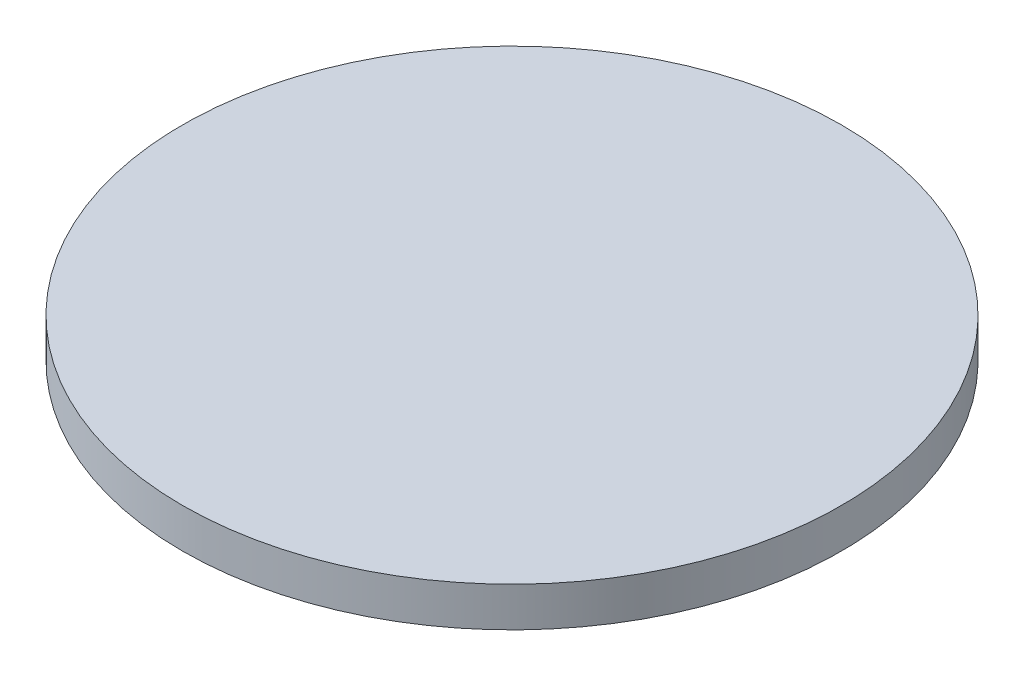
ISO-10303-21;
HEADER;
FILE_DESCRIPTION(('STEP AP214'),'2;1');
FILE_NAME('part.step','',(''),(''),'','','');
FILE_SCHEMA(('AUTOMOTIVE_DESIGN { 1 0 10303 214 1 1 1 1 }'));
ENDSEC;
DATA;
#1=APPLICATION_CONTEXT('core data for automotive mechanical design processes');
#2=APPLICATION_PROTOCOL_DEFINITION('international standard','automotive_design',2000,#1);
#3=PRODUCT_CONTEXT('',#1,'mechanical');
#4=PRODUCT('Part','Part','',(#3));
#5=PRODUCT_RELATED_PRODUCT_CATEGORY('part','',(#4));
#6=PRODUCT_DEFINITION_FORMATION('','',#4);
#7=PRODUCT_DEFINITION_CONTEXT('part definition',#1,'design');
#8=PRODUCT_DEFINITION('design','',#6,#7);
#9=PRODUCT_DEFINITION_SHAPE('','',#8);
#10=(LENGTH_UNIT() NAMED_UNIT(*) SI_UNIT(.MILLI.,.METRE.));
#11=(NAMED_UNIT(*) PLANE_ANGLE_UNIT() SI_UNIT($,.RADIAN.));
#12=(NAMED_UNIT(*) SI_UNIT($,.STERADIAN.) SOLID_ANGLE_UNIT());
#13=UNCERTAINTY_MEASURE_WITH_UNIT(LENGTH_MEASURE(1.E-05),#10,'distance_accuracy_value','');
#14=(GEOMETRIC_REPRESENTATION_CONTEXT(3) GLOBAL_UNCERTAINTY_ASSIGNED_CONTEXT((#13)) GLOBAL_UNIT_ASSIGNED_CONTEXT((#10,
#11,#12)) REPRESENTATION_CONTEXT('',''));
#15=CARTESIAN_POINT('',(0.,0.,0.));
#16=DIRECTION('',(0.,0.,1.));
#17=DIRECTION('',(1.,0.,0.));
#18=AXIS2_PLACEMENT_3D('',#15,#16,#17);
#19=CARTESIAN_POINT('',(-14.2129132931132,3.,-2.74872379725302));
#20=DIRECTION('',(0.,-1.,0.));
#21=DIRECTION('',(0.,0.,-1.));
#22=AXIS2_PLACEMENT_3D('',#19,#20,#21);
#23=CYLINDRICAL_SURFACE('',#22,25.);
#24=CARTESIAN_POINT('',(-14.2129132931132,3.,-2.74872379725302));
#25=DIRECTION('',(0.,1.,0.));
#26=DIRECTION('',(0.,0.,1.));
#27=AXIS2_PLACEMENT_3D('',#24,#25,#26);
#28=CIRCLE('',#27,25.);
#29=CARTESIAN_POINT('',(-14.2129132931132,3.,22.251276202747));
#30=VERTEX_POINT('',#29);
#31=EDGE_CURVE('E10',#30,#30,#28,.T.);
#32=ORIENTED_EDGE('',*,*,#31,.F.);
#33=EDGE_LOOP('',(#32));
#34=FACE_BOUND('',#33,.T.);
#35=CARTESIAN_POINT('',(-14.2129132931132,0.,-2.74872379725302));
#36=DIRECTION('',(0.,1.,0.));
#37=DIRECTION('',(0.,0.,1.));
#38=AXIS2_PLACEMENT_3D('',#35,#36,#37);
#39=CIRCLE('',#38,25.);
#40=CARTESIAN_POINT('',(-14.2129132931132,0.,22.251276202747));
#41=VERTEX_POINT('',#40);
#42=EDGE_CURVE('E44',#41,#41,#39,.T.);
#43=ORIENTED_EDGE('',*,*,#42,.T.);
#44=EDGE_LOOP('',(#43));
#45=FACE_BOUND('',#44,.T.);
#46=ADVANCED_FACE('F41',(#34,#45),#23,.T.);
#47=CARTESIAN_POINT('',(-14.2129132931132,3.,-2.74872379725302));
#48=DIRECTION('',(0.,1.,0.));
#49=DIRECTION('',(0.,0.,1.));
#50=AXIS2_PLACEMENT_3D('',#47,#48,#49);
#51=PLANE('',#50);
#52=ORIENTED_EDGE('',*,*,#31,.T.);
#53=EDGE_LOOP('',(#52));
#54=FACE_BOUND('',#53,.T.);
#55=ADVANCED_FACE('F58',(#54),#51,.T.);
#56=CARTESIAN_POINT('',(-14.2129132931132,0.,-2.74872379725302));
#57=DIRECTION('',(0.,1.,0.));
#58=DIRECTION('',(0.,0.,1.));
#59=AXIS2_PLACEMENT_3D('',#56,#57,#58);
#60=PLANE('',#59);
#61=ORIENTED_EDGE('',*,*,#42,.F.);
#62=EDGE_LOOP('',(#61));
#63=FACE_BOUND('',#62,.T.);
#64=ADVANCED_FACE('F56',(#63),#60,.F.);
#65=CLOSED_SHELL('',(#46,#55,#64));
#66=MANIFOLD_SOLID_BREP('B2',#65);
#67=ADVANCED_BREP_SHAPE_REPRESENTATION('',(#18,#66),#14);
#68=SHAPE_DEFINITION_REPRESENTATION(#9,#67);
ENDSEC;
END-ISO-10303-21;
